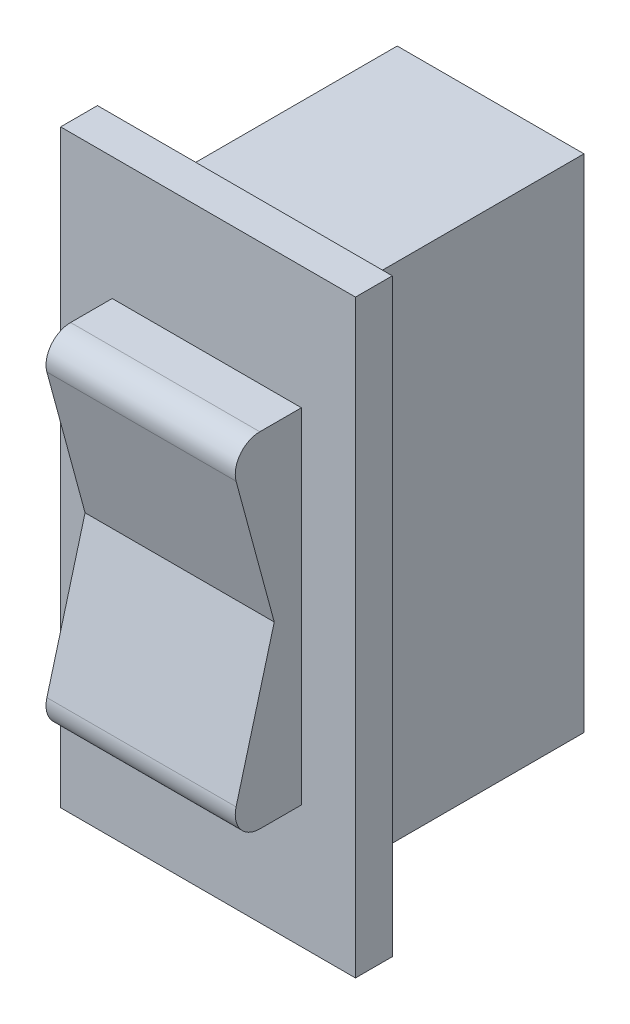
ISO-10303-21;
HEADER;
FILE_DESCRIPTION(('STEP AP214'),'2;1');
FILE_NAME('part.step','',(''),(''),'','','');
FILE_SCHEMA(('AUTOMOTIVE_DESIGN { 1 0 10303 214 1 1 1 1 }'));
ENDSEC;
DATA;
#1=APPLICATION_CONTEXT('core data for automotive mechanical design processes');
#2=APPLICATION_PROTOCOL_DEFINITION('international standard','automotive_design',2000,#1);
#3=PRODUCT_CONTEXT('',#1,'mechanical');
#4=PRODUCT('Part','Part','',(#3));
#5=PRODUCT_RELATED_PRODUCT_CATEGORY('part','',(#4));
#6=PRODUCT_DEFINITION_FORMATION('','',#4);
#7=PRODUCT_DEFINITION_CONTEXT('part definition',#1,'design');
#8=PRODUCT_DEFINITION('design','',#6,#7);
#9=PRODUCT_DEFINITION_SHAPE('','',#8);
#10=(LENGTH_UNIT() NAMED_UNIT(*) SI_UNIT(.MILLI.,.METRE.));
#11=(NAMED_UNIT(*) PLANE_ANGLE_UNIT() SI_UNIT($,.RADIAN.));
#12=(NAMED_UNIT(*) SI_UNIT($,.STERADIAN.) SOLID_ANGLE_UNIT());
#13=UNCERTAINTY_MEASURE_WITH_UNIT(LENGTH_MEASURE(1.E-05),#10,'distance_accuracy_value','');
#14=(GEOMETRIC_REPRESENTATION_CONTEXT(3) GLOBAL_UNCERTAINTY_ASSIGNED_CONTEXT((#13)) GLOBAL_UNIT_ASSIGNED_CONTEXT((#10,
#11,#12)) REPRESENTATION_CONTEXT('',''));
#15=CARTESIAN_POINT('',(0.,0.,0.));
#16=DIRECTION('',(0.,0.,1.));
#17=DIRECTION('',(1.,0.,0.));
#18=AXIS2_PLACEMENT_3D('',#15,#16,#17);
#19=CARTESIAN_POINT('',(0.,0.,11.5));
#20=DIRECTION('',(0.,0.,-1.));
#21=DIRECTION('',(-1.,0.,0.));
#22=AXIS2_PLACEMENT_3D('',#19,#20,#21);
#23=PLANE('',#22);
#24=DIRECTION('',(0.,1.,0.));
#25=VECTOR('',#24,1.);
#26=CARTESIAN_POINT('',(6.,-12.,11.5));
#27=LINE('',#26,#25);
#28=CARTESIAN_POINT('',(6.,-12.,11.5));
#29=VERTEX_POINT('',#28);
#30=CARTESIAN_POINT('',(6.,12.,11.5));
#31=VERTEX_POINT('',#30);
#32=EDGE_CURVE('E206',#29,#31,#27,.T.);
#33=ORIENTED_EDGE('',*,*,#32,.T.);
#34=DIRECTION('',(-1.,0.,0.));
#35=VECTOR('',#34,1.);
#36=CARTESIAN_POINT('',(-6.,12.,11.5));
#37=LINE('',#36,#35);
#38=CARTESIAN_POINT('',(-6.,12.,11.5));
#39=VERTEX_POINT('',#38);
#40=EDGE_CURVE('E210',#31,#39,#37,.T.);
#41=ORIENTED_EDGE('',*,*,#40,.T.);
#42=DIRECTION('',(0.,-1.,0.));
#43=VECTOR('',#42,1.);
#44=CARTESIAN_POINT('',(-6.,-12.,11.5));
#45=LINE('',#44,#43);
#46=CARTESIAN_POINT('',(-6.,-12.,11.5));
#47=VERTEX_POINT('',#46);
#48=EDGE_CURVE('E214',#39,#47,#45,.T.);
#49=ORIENTED_EDGE('',*,*,#48,.T.);
#50=DIRECTION('',(1.,0.,0.));
#51=VECTOR('',#50,1.);
#52=CARTESIAN_POINT('',(-6.,-12.,11.5));
#53=LINE('',#52,#51);
#54=EDGE_CURVE('E217',#47,#29,#53,.T.);
#55=ORIENTED_EDGE('',*,*,#54,.T.);
#56=EDGE_LOOP('',(#33,#41,#49,#55));
#57=FACE_BOUND('',#56,.T.);
#58=DIRECTION('',(0.,1.,0.));
#59=VECTOR('',#58,1.);
#60=CARTESIAN_POINT('',(3.8,7.,11.5));
#61=LINE('',#60,#59);
#62=CARTESIAN_POINT('',(3.8,-7.,11.5));
#63=VERTEX_POINT('',#62);
#64=CARTESIAN_POINT('',(3.8,7.,11.5));
#65=VERTEX_POINT('',#64);
#66=EDGE_CURVE('E189',#63,#65,#61,.T.);
#67=ORIENTED_EDGE('',*,*,#66,.F.);
#68=DIRECTION('',(1.,0.,0.));
#69=VECTOR('',#68,1.);
#70=CARTESIAN_POINT('',(-3.9,-7.,11.5));
#71=LINE('',#70,#69);
#72=CARTESIAN_POINT('',(-3.9,-7.,11.5));
#73=VERTEX_POINT('',#72);
#74=EDGE_CURVE('E173',#73,#63,#71,.T.);
#75=ORIENTED_EDGE('',*,*,#74,.F.);
#76=DIRECTION('',(0.,1.,0.));
#77=VECTOR('',#76,1.);
#78=CARTESIAN_POINT('',(-3.9,7.,11.5));
#79=LINE('',#78,#77);
#80=CARTESIAN_POINT('',(-3.9,7.,11.5));
#81=VERTEX_POINT('',#80);
#82=EDGE_CURVE('E167',#73,#81,#79,.T.);
#83=ORIENTED_EDGE('',*,*,#82,.T.);
#84=DIRECTION('',(1.,0.,0.));
#85=VECTOR('',#84,1.);
#86=CARTESIAN_POINT('',(-3.9,7.,11.5));
#87=LINE('',#86,#85);
#88=EDGE_CURVE('E150',#81,#65,#87,.T.);
#89=ORIENTED_EDGE('',*,*,#88,.T.);
#90=EDGE_LOOP('',(#67,#75,#83,#89));
#91=FACE_BOUND('',#90,.T.);
#92=ADVANCED_FACE('F42',(#57,#91),#23,.F.);
#93=CARTESIAN_POINT('',(3.8,-10.2,10.));
#94=DIRECTION('',(-1.,0.,0.));
#95=DIRECTION('',(0.,0.,1.));
#96=AXIS2_PLACEMENT_3D('',#93,#94,#95);
#97=PLANE('',#96);
#98=DIRECTION('',(0.,1.,0.));
#99=VECTOR('',#98,1.);
#100=CARTESIAN_POINT('',(3.8,-10.2,0.));
#101=LINE('',#100,#99);
#102=CARTESIAN_POINT('',(3.8,-10.2,0.));
#103=VERTEX_POINT('',#102);
#104=CARTESIAN_POINT('',(3.8,10.2,0.));
#105=VERTEX_POINT('',#104);
#106=EDGE_CURVE('E247',#103,#105,#101,.T.);
#107=ORIENTED_EDGE('',*,*,#106,.T.);
#108=DIRECTION('',(0.,0.,-1.));
#109=VECTOR('',#108,1.);
#110=CARTESIAN_POINT('',(3.8,10.2,10.));
#111=LINE('',#110,#109);
#112=CARTESIAN_POINT('',(3.8,10.2,10.));
#113=VERTEX_POINT('',#112);
#114=EDGE_CURVE('E288',#113,#105,#111,.T.);
#115=ORIENTED_EDGE('',*,*,#114,.F.);
#116=DIRECTION('',(0.,1.,0.));
#117=VECTOR('',#116,1.);
#118=CARTESIAN_POINT('',(3.8,-10.2,10.));
#119=LINE('',#118,#117);
#120=CARTESIAN_POINT('',(3.8,-10.2,10.));
#121=VERTEX_POINT('',#120);
#122=EDGE_CURVE('E248',#121,#113,#119,.T.);
#123=ORIENTED_EDGE('',*,*,#122,.F.);
#124=DIRECTION('',(0.,0.,-1.));
#125=VECTOR('',#124,1.);
#126=CARTESIAN_POINT('',(3.8,-10.2,10.));
#127=LINE('',#126,#125);
#128=EDGE_CURVE('E265',#121,#103,#127,.T.);
#129=ORIENTED_EDGE('',*,*,#128,.T.);
#130=EDGE_LOOP('',(#107,#115,#123,#129));
#131=FACE_BOUND('',#130,.T.);
#132=ADVANCED_FACE('F332',(#131),#97,.F.);
#133=CARTESIAN_POINT('',(-3.8,10.2,10.));
#134=DIRECTION('',(0.,-1.,0.));
#135=DIRECTION('',(0.,0.,-1.));
#136=AXIS2_PLACEMENT_3D('',#133,#134,#135);
#137=PLANE('',#136);
#138=DIRECTION('',(-1.,0.,0.));
#139=VECTOR('',#138,1.);
#140=CARTESIAN_POINT('',(-3.8,10.2,0.));
#141=LINE('',#140,#139);
#142=CARTESIAN_POINT('',(-3.8,10.2,0.));
#143=VERTEX_POINT('',#142);
#144=EDGE_CURVE('E269',#105,#143,#141,.T.);
#145=ORIENTED_EDGE('',*,*,#144,.T.);
#146=DIRECTION('',(0.,0.,-1.));
#147=VECTOR('',#146,1.);
#148=CARTESIAN_POINT('',(-3.8,10.2,10.));
#149=LINE('',#148,#147);
#150=CARTESIAN_POINT('',(-3.8,10.2,10.));
#151=VERTEX_POINT('',#150);
#152=EDGE_CURVE('E284',#151,#143,#149,.T.);
#153=ORIENTED_EDGE('',*,*,#152,.F.);
#154=DIRECTION('',(-1.,0.,0.));
#155=VECTOR('',#154,1.);
#156=CARTESIAN_POINT('',(-3.8,10.2,10.));
#157=LINE('',#156,#155);
#158=EDGE_CURVE('E252',#113,#151,#157,.T.);
#159=ORIENTED_EDGE('',*,*,#158,.F.);
#160=ORIENTED_EDGE('',*,*,#114,.T.);
#161=EDGE_LOOP('',(#145,#153,#159,#160));
#162=FACE_BOUND('',#161,.T.);
#163=ADVANCED_FACE('F338',(#162),#137,.F.);
#164=CARTESIAN_POINT('',(-3.8,-10.2,10.));
#165=DIRECTION('',(1.,0.,0.));
#166=DIRECTION('',(0.,0.,-1.));
#167=AXIS2_PLACEMENT_3D('',#164,#165,#166);
#168=PLANE('',#167);
#169=DIRECTION('',(0.,-1.,0.));
#170=VECTOR('',#169,1.);
#171=CARTESIAN_POINT('',(-3.8,-10.2,0.));
#172=LINE('',#171,#170);
#173=CARTESIAN_POINT('',(-3.8,-10.2,0.));
#174=VERTEX_POINT('',#173);
#175=EDGE_CURVE('E272',#143,#174,#172,.T.);
#176=ORIENTED_EDGE('',*,*,#175,.T.);
#177=DIRECTION('',(0.,0.,-1.));
#178=VECTOR('',#177,1.);
#179=CARTESIAN_POINT('',(-3.8,-10.2,10.));
#180=LINE('',#179,#178);
#181=CARTESIAN_POINT('',(-3.8,-10.2,10.));
#182=VERTEX_POINT('',#181);
#183=EDGE_CURVE('E280',#182,#174,#180,.T.);
#184=ORIENTED_EDGE('',*,*,#183,.F.);
#185=DIRECTION('',(0.,-1.,0.));
#186=VECTOR('',#185,1.);
#187=CARTESIAN_POINT('',(-3.8,-10.2,10.));
#188=LINE('',#187,#186);
#189=EDGE_CURVE('E257',#151,#182,#188,.T.);
#190=ORIENTED_EDGE('',*,*,#189,.F.);
#191=ORIENTED_EDGE('',*,*,#152,.T.);
#192=EDGE_LOOP('',(#176,#184,#190,#191));
#193=FACE_BOUND('',#192,.T.);
#194=ADVANCED_FACE('F371',(#193),#168,.F.);
#195=CARTESIAN_POINT('',(-3.8,-10.2,10.));
#196=DIRECTION('',(0.,1.,0.));
#197=DIRECTION('',(0.,0.,1.));
#198=AXIS2_PLACEMENT_3D('',#195,#196,#197);
#199=PLANE('',#198);
#200=DIRECTION('',(1.,0.,0.));
#201=VECTOR('',#200,1.);
#202=CARTESIAN_POINT('',(-3.8,-10.2,0.));
#203=LINE('',#202,#201);
#204=EDGE_CURVE('E253',#174,#103,#203,.T.);
#205=ORIENTED_EDGE('',*,*,#204,.T.);
#206=ORIENTED_EDGE('',*,*,#128,.F.);
#207=DIRECTION('',(1.,0.,0.));
#208=VECTOR('',#207,1.);
#209=CARTESIAN_POINT('',(-3.8,-10.2,10.));
#210=LINE('',#209,#208);
#211=EDGE_CURVE('E261',#182,#121,#210,.T.);
#212=ORIENTED_EDGE('',*,*,#211,.F.);
#213=ORIENTED_EDGE('',*,*,#183,.T.);
#214=EDGE_LOOP('',(#205,#206,#212,#213));
#215=FACE_BOUND('',#214,.T.);
#216=ADVANCED_FACE('F367',(#215),#199,.F.);
#217=CARTESIAN_POINT('',(0.,0.,0.));
#218=DIRECTION('',(0.,0.,-1.));
#219=DIRECTION('',(-1.,0.,0.));
#220=AXIS2_PLACEMENT_3D('',#217,#218,#219);
#221=PLANE('',#220);
#222=ORIENTED_EDGE('',*,*,#106,.F.);
#223=ORIENTED_EDGE('',*,*,#204,.F.);
#224=ORIENTED_EDGE('',*,*,#175,.F.);
#225=ORIENTED_EDGE('',*,*,#144,.F.);
#226=EDGE_LOOP('',(#222,#223,#224,#225));
#227=FACE_BOUND('',#226,.T.);
#228=ADVANCED_FACE('F363',(#227),#221,.T.);
#229=CARTESIAN_POINT('',(6.,-12.,11.5));
#230=DIRECTION('',(-1.,0.,0.));
#231=DIRECTION('',(0.,0.,1.));
#232=AXIS2_PLACEMENT_3D('',#229,#230,#231);
#233=PLANE('',#232);
#234=DIRECTION('',(0.,1.,0.));
#235=VECTOR('',#234,1.);
#236=CARTESIAN_POINT('',(6.,-12.,10.));
#237=LINE('',#236,#235);
#238=CARTESIAN_POINT('',(6.,-12.,10.));
#239=VERTEX_POINT('',#238);
#240=CARTESIAN_POINT('',(6.,12.,10.));
#241=VERTEX_POINT('',#240);
#242=EDGE_CURVE('E202',#239,#241,#237,.T.);
#243=ORIENTED_EDGE('',*,*,#242,.T.);
#244=DIRECTION('',(0.,0.,-1.));
#245=VECTOR('',#244,1.);
#246=CARTESIAN_POINT('',(6.,12.,11.5));
#247=LINE('',#246,#245);
#248=EDGE_CURVE('E243',#31,#241,#247,.T.);
#249=ORIENTED_EDGE('',*,*,#248,.F.);
#250=ORIENTED_EDGE('',*,*,#32,.F.);
#251=DIRECTION('',(0.,0.,-1.));
#252=VECTOR('',#251,1.);
#253=CARTESIAN_POINT('',(6.,-12.,11.5));
#254=LINE('',#253,#252);
#255=EDGE_CURVE('E220',#29,#239,#254,.T.);
#256=ORIENTED_EDGE('',*,*,#255,.T.);
#257=EDGE_LOOP('',(#243,#249,#250,#256));
#258=FACE_BOUND('',#257,.T.);
#259=ADVANCED_FACE('F359',(#258),#233,.F.);
#260=CARTESIAN_POINT('',(-6.,12.,11.5));
#261=DIRECTION('',(0.,-1.,0.));
#262=DIRECTION('',(0.,0.,-1.));
#263=AXIS2_PLACEMENT_3D('',#260,#261,#262);
#264=PLANE('',#263);
#265=DIRECTION('',(-1.,0.,0.));
#266=VECTOR('',#265,1.);
#267=CARTESIAN_POINT('',(-6.,12.,10.));
#268=LINE('',#267,#266);
#269=CARTESIAN_POINT('',(-6.,12.,10.));
#270=VERTEX_POINT('',#269);
#271=EDGE_CURVE('E224',#241,#270,#268,.T.);
#272=ORIENTED_EDGE('',*,*,#271,.T.);
#273=DIRECTION('',(0.,0.,-1.));
#274=VECTOR('',#273,1.);
#275=CARTESIAN_POINT('',(-6.,12.,11.5));
#276=LINE('',#275,#274);
#277=EDGE_CURVE('E239',#39,#270,#276,.T.);
#278=ORIENTED_EDGE('',*,*,#277,.F.);
#279=ORIENTED_EDGE('',*,*,#40,.F.);
#280=ORIENTED_EDGE('',*,*,#248,.T.);
#281=EDGE_LOOP('',(#272,#278,#279,#280));
#282=FACE_BOUND('',#281,.T.);
#283=ADVANCED_FACE('F355',(#282),#264,.F.);
#284=CARTESIAN_POINT('',(-6.,-12.,11.5));
#285=DIRECTION('',(1.,0.,0.));
#286=DIRECTION('',(0.,0.,-1.));
#287=AXIS2_PLACEMENT_3D('',#284,#285,#286);
#288=PLANE('',#287);
#289=DIRECTION('',(0.,-1.,0.));
#290=VECTOR('',#289,1.);
#291=CARTESIAN_POINT('',(-6.,-12.,10.));
#292=LINE('',#291,#290);
#293=CARTESIAN_POINT('',(-6.,-12.,10.));
#294=VERTEX_POINT('',#293);
#295=EDGE_CURVE('E227',#270,#294,#292,.T.);
#296=ORIENTED_EDGE('',*,*,#295,.T.);
#297=DIRECTION('',(0.,0.,-1.));
#298=VECTOR('',#297,1.);
#299=CARTESIAN_POINT('',(-6.,-12.,11.5));
#300=LINE('',#299,#298);
#301=EDGE_CURVE('E235',#47,#294,#300,.T.);
#302=ORIENTED_EDGE('',*,*,#301,.F.);
#303=ORIENTED_EDGE('',*,*,#48,.F.);
#304=ORIENTED_EDGE('',*,*,#277,.T.);
#305=EDGE_LOOP('',(#296,#302,#303,#304));
#306=FACE_BOUND('',#305,.T.);
#307=ADVANCED_FACE('F351',(#306),#288,.F.);
#308=CARTESIAN_POINT('',(-6.,-12.,11.5));
#309=DIRECTION('',(0.,1.,0.));
#310=DIRECTION('',(0.,0.,1.));
#311=AXIS2_PLACEMENT_3D('',#308,#309,#310);
#312=PLANE('',#311);
#313=DIRECTION('',(1.,0.,0.));
#314=VECTOR('',#313,1.);
#315=CARTESIAN_POINT('',(-6.,-12.,10.));
#316=LINE('',#315,#314);
#317=EDGE_CURVE('E211',#294,#239,#316,.T.);
#318=ORIENTED_EDGE('',*,*,#317,.T.);
#319=ORIENTED_EDGE('',*,*,#255,.F.);
#320=ORIENTED_EDGE('',*,*,#54,.F.);
#321=ORIENTED_EDGE('',*,*,#301,.T.);
#322=EDGE_LOOP('',(#318,#319,#320,#321));
#323=FACE_BOUND('',#322,.T.);
#324=ADVANCED_FACE('F347',(#323),#312,.F.);
#325=CARTESIAN_POINT('',(0.,0.,10.));
#326=DIRECTION('',(0.,0.,-1.));
#327=DIRECTION('',(-1.,0.,0.));
#328=AXIS2_PLACEMENT_3D('',#325,#326,#327);
#329=PLANE('',#328);
#330=ORIENTED_EDGE('',*,*,#211,.T.);
#331=ORIENTED_EDGE('',*,*,#122,.T.);
#332=ORIENTED_EDGE('',*,*,#158,.T.);
#333=ORIENTED_EDGE('',*,*,#189,.T.);
#334=EDGE_LOOP('',(#330,#331,#332,#333));
#335=FACE_BOUND('',#334,.T.);
#336=ORIENTED_EDGE('',*,*,#242,.F.);
#337=ORIENTED_EDGE('',*,*,#317,.F.);
#338=ORIENTED_EDGE('',*,*,#295,.F.);
#339=ORIENTED_EDGE('',*,*,#271,.F.);
#340=EDGE_LOOP('',(#336,#337,#338,#339));
#341=FACE_BOUND('',#340,.T.);
#342=ADVANCED_FACE('F344',(#335,#341),#329,.T.);
#343=CARTESIAN_POINT('',(-3.9,-7.,11.5));
#344=DIRECTION('',(0.,-1.,0.));
#345=DIRECTION('',(0.,0.,-1.));
#346=AXIS2_PLACEMENT_3D('',#343,#344,#345);
#347=PLANE('',#346);
#348=DIRECTION('',(0.,0.,-1.));
#349=VECTOR('',#348,1.);
#350=CARTESIAN_POINT('',(3.8,-7.,11.5));
#351=LINE('',#350,#349);
#352=CARTESIAN_POINT('',(3.8,-7.,13.1932564158772));
#353=VERTEX_POINT('',#352);
#354=EDGE_CURVE('E175',#353,#63,#351,.T.);
#355=ORIENTED_EDGE('',*,*,#354,.F.);
#356=DIRECTION('',(1.,0.,0.));
#357=VECTOR('',#356,1.);
#358=CARTESIAN_POINT('',(-3.9,-7.,13.1932564158772));
#359=LINE('',#358,#357);
#360=CARTESIAN_POINT('',(-3.9,-7.,13.1932564158772));
#361=VERTEX_POINT('',#360);
#362=EDGE_CURVE('E302',#353,#361,#359,.F.);
#363=ORIENTED_EDGE('',*,*,#362,.T.);
#364=DIRECTION('',(0.,0.,-1.));
#365=VECTOR('',#364,1.);
#366=CARTESIAN_POINT('',(-3.9,-7.,11.5));
#367=LINE('',#366,#365);
#368=EDGE_CURVE('E162',#361,#73,#367,.T.);
#369=ORIENTED_EDGE('',*,*,#368,.T.);
#370=ORIENTED_EDGE('',*,*,#74,.T.);
#371=EDGE_LOOP('',(#355,#363,#369,#370));
#372=FACE_BOUND('',#371,.T.);
#373=ADVANCED_FACE('F316',(#372),#347,.T.);
#374=CARTESIAN_POINT('',(-3.9,0.,12.6048112182437));
#375=DIRECTION('',(0.,0.261332669632849,0.965248794758413));
#376=DIRECTION('',(0.,-0.965248794758413,0.261332669632849));
#377=AXIS2_PLACEMENT_3D('',#374,#375,#376);
#378=PLANE('',#377);
#379=DIRECTION('',(0.,-0.965248794758413,0.261332669632849));
#380=VECTOR('',#379,1.);
#381=CARTESIAN_POINT('',(-3.9,0.,12.6048112182437));
#382=LINE('',#381,#380);
#383=CARTESIAN_POINT('',(-3.9,0.,12.6048112182437));
#384=VERTEX_POINT('',#383);
#385=CARTESIAN_POINT('',(-3.9,-5.73866733036715,14.1585052106356));
#386=VERTEX_POINT('',#385);
#387=EDGE_CURVE('E183',#384,#386,#382,.T.);
#388=ORIENTED_EDGE('',*,*,#387,.T.);
#389=DIRECTION('',(1.,0.,0.));
#390=VECTOR('',#389,1.);
#391=CARTESIAN_POINT('',(-3.9,-5.73866733036715,14.1585052106356));
#392=LINE('',#391,#390);
#393=CARTESIAN_POINT('',(3.8,-5.73866733036715,14.1585052106356));
#394=VERTEX_POINT('',#393);
#395=EDGE_CURVE('E292',#386,#394,#392,.T.);
#396=ORIENTED_EDGE('',*,*,#395,.T.);
#397=DIRECTION('',(0.,-0.965248794758413,0.261332669632849));
#398=VECTOR('',#397,1.);
#399=CARTESIAN_POINT('',(3.8,0.,12.6048112182437));
#400=LINE('',#399,#398);
#401=CARTESIAN_POINT('',(3.8,0.,12.6048112182437));
#402=VERTEX_POINT('',#401);
#403=EDGE_CURVE('E178',#402,#394,#400,.T.);
#404=ORIENTED_EDGE('',*,*,#403,.F.);
#405=DIRECTION('',(1.,0.,0.));
#406=VECTOR('',#405,1.);
#407=CARTESIAN_POINT('',(-3.9,0.,12.6048112182437));
#408=LINE('',#407,#406);
#409=EDGE_CURVE('E161',#384,#402,#408,.T.);
#410=ORIENTED_EDGE('',*,*,#409,.F.);
#411=EDGE_LOOP('',(#388,#396,#404,#410));
#412=FACE_BOUND('',#411,.T.);
#413=ADVANCED_FACE('F324',(#412),#378,.T.);
#414=CARTESIAN_POINT('',(-3.9,7.,14.5));
#415=DIRECTION('',(0.,-0.261332669632849,0.965248794758413));
#416=DIRECTION('',(0.,-0.965248794758413,-0.261332669632849));
#417=AXIS2_PLACEMENT_3D('',#414,#415,#416);
#418=PLANE('',#417);
#419=DIRECTION('',(0.,-0.965248794758413,-0.261332669632849));
#420=VECTOR('',#419,1.);
#421=CARTESIAN_POINT('',(3.8,7.,14.5));
#422=LINE('',#421,#420);
#423=CARTESIAN_POINT('',(3.8,5.73866733036715,14.1585052106356));
#424=VERTEX_POINT('',#423);
#425=EDGE_CURVE('E194',#424,#402,#422,.T.);
#426=ORIENTED_EDGE('',*,*,#425,.F.);
#427=DIRECTION('',(1.,0.,0.));
#428=VECTOR('',#427,1.);
#429=CARTESIAN_POINT('',(-3.9,5.73866733036715,14.1585052106356));
#430=LINE('',#429,#428);
#431=CARTESIAN_POINT('',(-3.9,5.73866733036715,14.1585052106356));
#432=VERTEX_POINT('',#431);
#433=EDGE_CURVE('E11',#424,#432,#430,.F.);
#434=ORIENTED_EDGE('',*,*,#433,.T.);
#435=DIRECTION('',(0.,-0.965248794758413,-0.261332669632849));
#436=VECTOR('',#435,1.);
#437=CARTESIAN_POINT('',(-3.9,7.,14.5));
#438=LINE('',#437,#436);
#439=EDGE_CURVE('E170',#432,#384,#438,.T.);
#440=ORIENTED_EDGE('',*,*,#439,.T.);
#441=ORIENTED_EDGE('',*,*,#409,.T.);
#442=EDGE_LOOP('',(#426,#434,#440,#441));
#443=FACE_BOUND('',#442,.T.);
#444=ADVANCED_FACE('F326',(#443),#418,.T.);
#445=CARTESIAN_POINT('',(-3.9,7.,11.5));
#446=DIRECTION('',(0.,1.,0.));
#447=DIRECTION('',(0.,0.,1.));
#448=AXIS2_PLACEMENT_3D('',#445,#446,#447);
#449=PLANE('',#448);
#450=DIRECTION('',(0.,0.,1.));
#451=VECTOR('',#450,1.);
#452=CARTESIAN_POINT('',(-3.9,7.,11.5));
#453=LINE('',#452,#451);
#454=CARTESIAN_POINT('',(-3.9,7.,13.1932564158772));
#455=VERTEX_POINT('',#454);
#456=EDGE_CURVE('E153',#81,#455,#453,.T.);
#457=ORIENTED_EDGE('',*,*,#456,.T.);
#458=DIRECTION('',(1.,0.,0.));
#459=VECTOR('',#458,1.);
#460=CARTESIAN_POINT('',(-3.9,7.,13.1932564158772));
#461=LINE('',#460,#459);
#462=CARTESIAN_POINT('',(3.8,7.,13.1932564158772));
#463=VERTEX_POINT('',#462);
#464=EDGE_CURVE('E51',#455,#463,#461,.T.);
#465=ORIENTED_EDGE('',*,*,#464,.T.);
#466=DIRECTION('',(0.,0.,1.));
#467=VECTOR('',#466,1.);
#468=CARTESIAN_POINT('',(3.8,7.,11.5));
#469=LINE('',#468,#467);
#470=EDGE_CURVE('E156',#65,#463,#469,.T.);
#471=ORIENTED_EDGE('',*,*,#470,.F.);
#472=ORIENTED_EDGE('',*,*,#88,.F.);
#473=EDGE_LOOP('',(#457,#465,#471,#472));
#474=FACE_BOUND('',#473,.T.);
#475=ADVANCED_FACE('F151',(#474),#449,.T.);
#476=CARTESIAN_POINT('',(-3.9,0.,0.));
#477=DIRECTION('',(-1.,0.,0.));
#478=DIRECTION('',(0.,0.,1.));
#479=AXIS2_PLACEMENT_3D('',#476,#477,#478);
#480=PLANE('',#479);
#481=ORIENTED_EDGE('',*,*,#368,.F.);
#482=CARTESIAN_POINT('',(-3.9,-6.,13.1932564158772));
#483=DIRECTION('',(-1.,0.,0.));
#484=DIRECTION('',(0.,0.,1.));
#485=AXIS2_PLACEMENT_3D('',#482,#483,#484);
#486=CIRCLE('',#485,1.);
#487=EDGE_CURVE('E307',#361,#386,#486,.T.);
#488=ORIENTED_EDGE('',*,*,#487,.T.);
#489=ORIENTED_EDGE('',*,*,#387,.F.);
#490=ORIENTED_EDGE('',*,*,#439,.F.);
#491=CARTESIAN_POINT('',(-3.9,6.,13.1932564158772));
#492=DIRECTION('',(-1.,0.,0.));
#493=DIRECTION('',(0.,0.,1.));
#494=AXIS2_PLACEMENT_3D('',#491,#492,#493);
#495=CIRCLE('',#494,1.);
#496=EDGE_CURVE('E58',#432,#455,#495,.T.);
#497=ORIENTED_EDGE('',*,*,#496,.T.);
#498=ORIENTED_EDGE('',*,*,#456,.F.);
#499=ORIENTED_EDGE('',*,*,#82,.F.);
#500=EDGE_LOOP('',(#481,#488,#489,#490,#497,#498,#499));
#501=FACE_BOUND('',#500,.T.);
#502=ADVANCED_FACE('F166',(#501),#480,.T.);
#503=CARTESIAN_POINT('',(3.8,0.,0.));
#504=DIRECTION('',(-1.,0.,0.));
#505=DIRECTION('',(0.,0.,1.));
#506=AXIS2_PLACEMENT_3D('',#503,#504,#505);
#507=PLANE('',#506);
#508=ORIENTED_EDGE('',*,*,#403,.T.);
#509=CARTESIAN_POINT('',(3.8,-6.,13.1932564158772));
#510=DIRECTION('',(-1.,0.,0.));
#511=DIRECTION('',(0.,0.,1.));
#512=AXIS2_PLACEMENT_3D('',#509,#510,#511);
#513=CIRCLE('',#512,1.);
#514=EDGE_CURVE('E299',#394,#353,#513,.F.);
#515=ORIENTED_EDGE('',*,*,#514,.T.);
#516=ORIENTED_EDGE('',*,*,#354,.T.);
#517=ORIENTED_EDGE('',*,*,#66,.T.);
#518=ORIENTED_EDGE('',*,*,#470,.T.);
#519=CARTESIAN_POINT('',(3.8,6.,13.1932564158772));
#520=DIRECTION('',(-1.,0.,0.));
#521=DIRECTION('',(0.,0.,1.));
#522=AXIS2_PLACEMENT_3D('',#519,#520,#521);
#523=CIRCLE('',#522,1.);
#524=EDGE_CURVE('E296',#463,#424,#523,.F.);
#525=ORIENTED_EDGE('',*,*,#524,.T.);
#526=ORIENTED_EDGE('',*,*,#425,.T.);
#527=EDGE_LOOP('',(#508,#515,#516,#517,#518,#525,#526));
#528=FACE_BOUND('',#527,.T.);
#529=ADVANCED_FACE('F312',(#528),#507,.F.);
#530=CARTESIAN_POINT('',(-3.9,-6.,13.1932564158772));
#531=DIRECTION('',(1.,0.,0.));
#532=DIRECTION('',(0.,0.,-1.));
#533=AXIS2_PLACEMENT_3D('',#530,#531,#532);
#534=CYLINDRICAL_SURFACE('',#533,1.);
#535=ORIENTED_EDGE('',*,*,#487,.F.);
#536=ORIENTED_EDGE('',*,*,#362,.F.);
#537=ORIENTED_EDGE('',*,*,#514,.F.);
#538=ORIENTED_EDGE('',*,*,#395,.F.);
#539=EDGE_LOOP('',(#535,#536,#537,#538));
#540=FACE_BOUND('',#539,.T.);
#541=ADVANCED_FACE('F321',(#540),#534,.T.);
#542=CARTESIAN_POINT('',(-3.9,6.,13.1932564158772));
#543=DIRECTION('',(1.,0.,0.));
#544=DIRECTION('',(0.,0.,-1.));
#545=AXIS2_PLACEMENT_3D('',#542,#543,#544);
#546=CYLINDRICAL_SURFACE('',#545,1.);
#547=ORIENTED_EDGE('',*,*,#496,.F.);
#548=ORIENTED_EDGE('',*,*,#433,.F.);
#549=ORIENTED_EDGE('',*,*,#524,.F.);
#550=ORIENTED_EDGE('',*,*,#464,.F.);
#551=EDGE_LOOP('',(#547,#548,#549,#550));
#552=FACE_BOUND('',#551,.T.);
#553=ADVANCED_FACE('F44',(#552),#546,.T.);
#554=CLOSED_SHELL('',(#92,#132,#163,#194,#216,#228,#259,#283,#307,#324,#342,#373,#413,#444,#475,
#502,#529,#541,#553));
#555=MANIFOLD_SOLID_BREP('B2',#554);
#556=ADVANCED_BREP_SHAPE_REPRESENTATION('',(#18,#555),#14);
#557=SHAPE_DEFINITION_REPRESENTATION(#9,#556);
ENDSEC;
END-ISO-10303-21;
